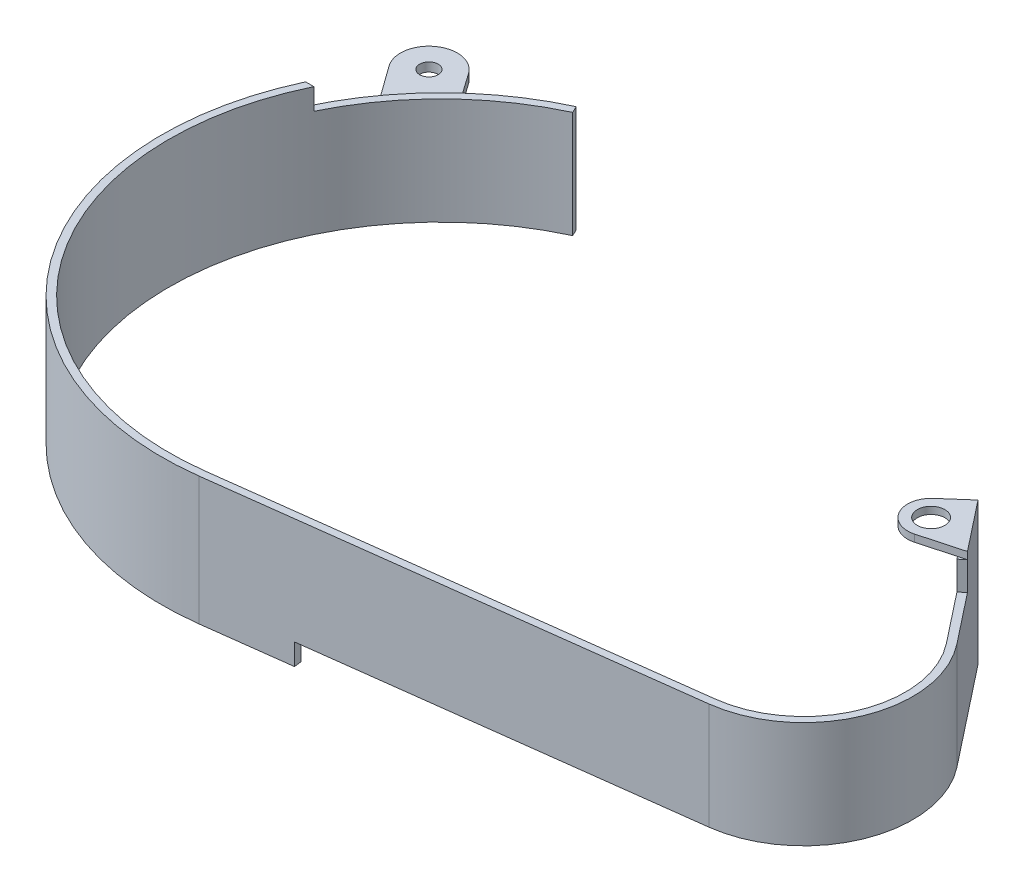
ISO-10303-21;
HEADER;
FILE_DESCRIPTION(('STEP AP214'),'2;1');
FILE_NAME('part.step','',(''),(''),'','','');
FILE_SCHEMA(('AUTOMOTIVE_DESIGN { 1 0 10303 214 1 1 1 1 }'));
ENDSEC;
DATA;
#1=APPLICATION_CONTEXT('core data for automotive mechanical design processes');
#2=APPLICATION_PROTOCOL_DEFINITION('international standard','automotive_design',2000,#1);
#3=PRODUCT_CONTEXT('',#1,'mechanical');
#4=PRODUCT('Part','Part','',(#3));
#5=PRODUCT_RELATED_PRODUCT_CATEGORY('part','',(#4));
#6=PRODUCT_DEFINITION_FORMATION('','',#4);
#7=PRODUCT_DEFINITION_CONTEXT('part definition',#1,'design');
#8=PRODUCT_DEFINITION('design','',#6,#7);
#9=PRODUCT_DEFINITION_SHAPE('','',#8);
#10=(LENGTH_UNIT() NAMED_UNIT(*) SI_UNIT(.MILLI.,.METRE.));
#11=(NAMED_UNIT(*) PLANE_ANGLE_UNIT() SI_UNIT($,.RADIAN.));
#12=(NAMED_UNIT(*) SI_UNIT($,.STERADIAN.) SOLID_ANGLE_UNIT());
#13=UNCERTAINTY_MEASURE_WITH_UNIT(LENGTH_MEASURE(1.E-05),#10,'distance_accuracy_value','');
#14=(GEOMETRIC_REPRESENTATION_CONTEXT(3) GLOBAL_UNCERTAINTY_ASSIGNED_CONTEXT((#13)) GLOBAL_UNIT_ASSIGNED_CONTEXT((#10,
#11,#12)) REPRESENTATION_CONTEXT('',''));
#15=CARTESIAN_POINT('',(0.,0.,0.));
#16=DIRECTION('',(0.,0.,1.));
#17=DIRECTION('',(1.,0.,0.));
#18=AXIS2_PLACEMENT_3D('',#15,#16,#17);
#19=CARTESIAN_POINT('',(0.,10.16,0.));
#20=DIRECTION('',(0.,-1.,0.));
#21=DIRECTION('',(0.,0.,-1.));
#22=AXIS2_PLACEMENT_3D('',#19,#20,#21);
#23=PLANE('',#22);
#24=DIRECTION('',(0.964468458141536,0.,-0.264198019012422));
#25=VECTOR('',#24,1.);
#26=CARTESIAN_POINT('',(-498.33467142778,10.16,85.9682052283559));
#27=LINE('',#26,#25);
#28=CARTESIAN_POINT('',(-486.340425898208,10.16,82.6826069470314));
#29=VERTEX_POINT('',#28);
#30=CARTESIAN_POINT('',(-483.547414247584,10.16,81.9175138649877));
#31=VERTEX_POINT('',#30);
#32=EDGE_CURVE('E12',#29,#31,#27,.T.);
#33=ORIENTED_EDGE('',*,*,#32,.F.);
#34=DIRECTION('',(0.619138375896092,0.,0.785281905746433));
#35=VECTOR('',#34,1.);
#36=CARTESIAN_POINT('',(-499.562056453275,10.16,65.9129999519377));
#37=LINE('',#36,#35);
#38=CARTESIAN_POINT('',(-485.591791320348,10.16,83.6321348892451));
#39=VERTEX_POINT('',#38);
#40=EDGE_CURVE('E252',#29,#39,#37,.T.);
#41=ORIENTED_EDGE('',*,*,#40,.T.);
#42=DIRECTION('',(0.766194829754674,0.,-0.642608343283221));
#43=VECTOR('',#42,1.);
#44=CARTESIAN_POINT('',(-485.591791320348,10.16,83.6321348892451));
#45=LINE('',#44,#43);
#46=EDGE_CURVE('E257',#39,#31,#45,.T.);
#47=ORIENTED_EDGE('',*,*,#46,.T.);
#48=EDGE_LOOP('',(#33,#41,#47));
#49=FACE_BOUND('',#48,.T.);
#50=ADVANCED_FACE('F50',(#49),#23,.F.);
#51=CARTESIAN_POINT('',(-669.29,0.,84.2514773719377));
#52=DIRECTION('',(0.,-1.,0.));
#53=DIRECTION('',(0.,0.,-1.));
#54=AXIS2_PLACEMENT_3D('',#51,#52,#53);
#55=PLANE('',#54);
#56=DIRECTION('',(0.766194829754674,0.,-0.642608343283221));
#57=VECTOR('',#56,1.);
#58=CARTESIAN_POINT('',(-485.591791320348,0.,83.6321348892451));
#59=LINE('',#58,#57);
#60=CARTESIAN_POINT('',(-485.591791320348,0.,83.6321348892451));
#61=VERTEX_POINT('',#60);
#62=CARTESIAN_POINT('',(-483.547414247584,0.,81.9175138649877));
#63=VERTEX_POINT('',#62);
#64=EDGE_CURVE('E75',#61,#63,#59,.T.);
#65=ORIENTED_EDGE('',*,*,#64,.F.);
#66=DIRECTION('',(0.61913837589609,0.,0.785281905746435));
#67=VECTOR('',#66,1.);
#68=CARTESIAN_POINT('',(-471.62152618742,0.,101.351269826553));
#69=LINE('',#68,#67);
#70=CARTESIAN_POINT('',(-471.62152618742,0.,101.351269826552));
#71=VERTEX_POINT('',#70);
#72=EDGE_CURVE('E421',#61,#71,#69,.T.);
#73=ORIENTED_EDGE('',*,*,#72,.T.);
#74=CARTESIAN_POINT('',(-500.126000000001,0.,123.824999951937));
#75=DIRECTION('',(0.,-1.,0.));
#76=DIRECTION('',(0.,0.,1.));
#77=AXIS2_PLACEMENT_3D('',#74,#75,#76);
#78=CIRCLE('',#77,36.2983962880004);
#79=CARTESIAN_POINT('',(-495.540915966686,0.,159.832646049512));
#80=VERTEX_POINT('',#79);
#81=EDGE_CURVE('E424',#71,#80,#78,.T.);
#82=ORIENTED_EDGE('',*,*,#81,.T.);
#83=DIRECTION('',(-0.991989999003838,0.,0.126316435495806));
#84=VECTOR('',#83,1.);
#85=CARTESIAN_POINT('',(-657.047015902535,0.,180.398251423772));
#86=LINE('',#85,#84);
#87=CARTESIAN_POINT('',(-657.047015902535,0.,180.398251423772));
#88=VERTEX_POINT('',#87);
#89=EDGE_CURVE('E380',#80,#88,#86,.T.);
#90=ORIENTED_EDGE('',*,*,#89,.T.);
#91=CARTESIAN_POINT('',(-669.29,0.,84.2514773719377));
#92=DIRECTION('',(0.,-1.,0.));
#93=DIRECTION('',(0.,0.,-1.));
#94=AXIS2_PLACEMENT_3D('',#91,#92,#93);
#95=CIRCLE('',#94,96.9231284069251);
#96=CARTESIAN_POINT('',(-756.600744677042,0.,42.1690976373534));
#97=VERTEX_POINT('',#96);
#98=EDGE_CURVE('E373',#88,#97,#95,.T.);
#99=ORIENTED_EDGE('',*,*,#98,.T.);
#100=DIRECTION('',(1.,0.,0.));
#101=VECTOR('',#100,1.);
#102=CARTESIAN_POINT('',(-756.600744677042,0.,42.1690976373534));
#103=LINE('',#102,#101);
#104=CARTESIAN_POINT('',(-759.552212425699,0.,42.1690976373534));
#105=VERTEX_POINT('',#104);
#106=EDGE_CURVE('E342',#105,#97,#103,.T.);
#107=ORIENTED_EDGE('',*,*,#106,.F.);
#108=CARTESIAN_POINT('',(-669.29,0.,84.2514773719377));
#109=DIRECTION('',(0.,1.,0.));
#110=DIRECTION('',(0.,0.,-1.));
#111=AXIS2_PLACEMENT_3D('',#108,#109,#110);
#112=CIRCLE('',#111,99.590128406925);
#113=CARTESIAN_POINT('',(-656.710129969068,0.,183.043888751115));
#114=VERTEX_POINT('',#113);
#115=EDGE_CURVE('E407',#105,#114,#112,.T.);
#116=ORIENTED_EDGE('',*,*,#115,.T.);
#117=DIRECTION('',(0.991989999003838,0.,-0.126316435495805));
#118=VECTOR('',#117,1.);
#119=CARTESIAN_POINT('',(-656.710129969068,0.,183.043888751115));
#120=LINE('',#119,#118);
#121=CARTESIAN_POINT('',(-495.204030033218,0.,162.478283376855));
#122=VERTEX_POINT('',#121);
#123=EDGE_CURVE('E410',#114,#122,#120,.T.);
#124=ORIENTED_EDGE('',*,*,#123,.T.);
#125=CARTESIAN_POINT('',(-500.126,0.,123.824999951938));
#126=DIRECTION('',(0.,1.,0.));
#127=DIRECTION('',(0.,0.,-1.));
#128=AXIS2_PLACEMENT_3D('',#125,#126,#127);
#129=CIRCLE('',#128,38.9653962880001);
#130=CARTESIAN_POINT('',(-469.527179344794,0.,99.7000277780376));
#131=VERTEX_POINT('',#130);
#132=EDGE_CURVE('E414',#122,#131,#129,.T.);
#133=ORIENTED_EDGE('',*,*,#132,.T.);
#134=DIRECTION('',(-0.619138375896093,0.,-0.785281905746432));
#135=VECTOR('',#134,1.);
#136=CARTESIAN_POINT('',(-469.527179344794,0.,99.7000277780376));
#137=LINE('',#136,#135);
#138=EDGE_CURVE('E418',#131,#63,#137,.T.);
#139=ORIENTED_EDGE('',*,*,#138,.T.);
#140=EDGE_LOOP('',(#65,#73,#82,#90,#99,#107,#116,#124,#133,#139));
#141=FACE_BOUND('',#140,.T.);
#142=ADVANCED_FACE('F485',(#141),#55,.F.);
#143=CARTESIAN_POINT('',(-669.29,-38.1,84.2514773719377));
#144=DIRECTION('',(0.,1.,0.));
#145=DIRECTION('',(0.,0.,1.));
#146=AXIS2_PLACEMENT_3D('',#143,#144,#145);
#147=CYLINDRICAL_SURFACE('',#146,99.590128406925);
#148=DIRECTION('',(0.,1.,0.));
#149=VECTOR('',#148,1.);
#150=CARTESIAN_POINT('',(-759.552212425699,-7.62,42.1690976373533));
#151=LINE('',#150,#149);
#152=CARTESIAN_POINT('',(-759.552212425699,-7.62,42.1690976373533));
#153=VERTEX_POINT('',#152);
#154=EDGE_CURVE('E366',#153,#105,#151,.T.);
#155=ORIENTED_EDGE('',*,*,#154,.F.);
#156=CARTESIAN_POINT('',(-669.29,-7.62,84.2514773719377));
#157=DIRECTION('',(0.,1.,0.));
#158=DIRECTION('',(0.,0.,-1.));
#159=AXIS2_PLACEMENT_3D('',#156,#157,#158);
#160=CIRCLE('',#159,99.5901284069251);
#161=CARTESIAN_POINT('',(-711.2,-7.62,-6.0909023626467));
#162=VERTEX_POINT('',#161);
#163=EDGE_CURVE('E359',#162,#153,#160,.T.);
#164=ORIENTED_EDGE('',*,*,#163,.F.);
#165=DIRECTION('',(0.,1.,0.));
#166=VECTOR('',#165,1.);
#167=CARTESIAN_POINT('',(-711.2,-38.1,-6.0909023626466));
#168=LINE('',#167,#166);
#169=CARTESIAN_POINT('',(-711.2,-45.72,-6.0909023626466));
#170=VERTEX_POINT('',#169);
#171=EDGE_CURVE('E455',#170,#162,#168,.T.);
#172=ORIENTED_EDGE('',*,*,#171,.F.);
#173=CARTESIAN_POINT('',(-669.29,-45.72,84.2514773719377));
#174=DIRECTION('',(0.,-1.,0.));
#175=DIRECTION('',(0.,0.,-1.));
#176=AXIS2_PLACEMENT_3D('',#173,#174,#175);
#177=CIRCLE('',#176,99.590128406925);
#178=CARTESIAN_POINT('',(-656.710129969068,-45.72,183.043888751115));
#179=VERTEX_POINT('',#178);
#180=EDGE_CURVE('E282',#179,#170,#177,.T.);
#181=ORIENTED_EDGE('',*,*,#180,.F.);
#182=DIRECTION('',(0.,1.,0.));
#183=VECTOR('',#182,1.);
#184=CARTESIAN_POINT('',(-656.710129969068,-38.1,183.043888751115));
#185=LINE('',#184,#183);
#186=EDGE_CURVE('E452',#179,#114,#185,.T.);
#187=ORIENTED_EDGE('',*,*,#186,.T.);
#188=ORIENTED_EDGE('',*,*,#115,.F.);
#189=EDGE_LOOP('',(#155,#164,#172,#181,#187,#188));
#190=FACE_BOUND('',#189,.T.);
#191=DIRECTION('',(0.,1.,0.));
#192=VECTOR('',#191,1.);
#193=CARTESIAN_POINT('',(-750.190181644092,-15.10675668,26.1708929563116));
#194=LINE('',#193,#192);
#195=CARTESIAN_POINT('',(-750.190181644093,-15.10675668,26.1708929563117));
#196=VERTEX_POINT('',#195);
#197=CARTESIAN_POINT('',(-750.190181644093,-11.93175668,26.1708929563116));
#198=VERTEX_POINT('',#197);
#199=EDGE_CURVE('E322',#196,#198,#194,.T.);
#200=ORIENTED_EDGE('',*,*,#199,.F.);
#201=CARTESIAN_POINT('',(-669.29,-15.10675668,84.2514773719377));
#202=DIRECTION('',(0.,1.,0.));
#203=DIRECTION('',(0.,0.,1.));
#204=AXIS2_PLACEMENT_3D('',#201,#202,#203);
#205=CIRCLE('',#204,99.590128406925);
#206=CARTESIAN_POINT('',(-736.454096433677,-15.10675668,10.717962384855));
#207=VERTEX_POINT('',#206);
#208=EDGE_CURVE('E306',#207,#196,#205,.T.);
#209=ORIENTED_EDGE('',*,*,#208,.F.);
#210=DIRECTION('',(0.,1.,0.));
#211=VECTOR('',#210,1.);
#212=CARTESIAN_POINT('',(-736.454096433677,-15.10675668,10.7179623848548));
#213=LINE('',#212,#211);
#214=CARTESIAN_POINT('',(-736.454096433677,-11.93175668,10.7179623848548));
#215=VERTEX_POINT('',#214);
#216=EDGE_CURVE('E347',#207,#215,#213,.T.);
#217=ORIENTED_EDGE('',*,*,#216,.T.);
#218=CARTESIAN_POINT('',(-669.29,-11.93175668,84.2514773719377));
#219=DIRECTION('',(0.,1.,0.));
#220=DIRECTION('',(0.,0.,1.));
#221=AXIS2_PLACEMENT_3D('',#218,#219,#220);
#222=CIRCLE('',#221,99.590128406925);
#223=EDGE_CURVE('E326',#215,#198,#222,.T.);
#224=ORIENTED_EDGE('',*,*,#223,.T.);
#225=EDGE_LOOP('',(#200,#209,#217,#224));
#226=FACE_BOUND('',#225,.T.);
#227=ADVANCED_FACE('F473',(#190,#226),#147,.T.);
#228=CARTESIAN_POINT('',(-710.077660147768,-38.1,-3.6715548770441));
#229=DIRECTION('',(0.907141914361682,0.,-0.420824841481849));
#230=DIRECTION('',(-0.420824841481849,0.,-0.907141914361682));
#231=AXIS2_PLACEMENT_3D('',#228,#229,#230);
#232=PLANE('',#231);
#233=ORIENTED_EDGE('',*,*,#171,.T.);
#234=DIRECTION('',(-0.420824841481849,0.,-0.907141914361682));
#235=VECTOR('',#234,1.);
#236=CARTESIAN_POINT('',(-710.077660147768,-7.62,-3.6715548770441));
#237=LINE('',#236,#235);
#238=CARTESIAN_POINT('',(-710.077660147768,-7.62,-3.6715548770441));
#239=VERTEX_POINT('',#238);
#240=EDGE_CURVE('E356',#239,#162,#237,.T.);
#241=ORIENTED_EDGE('',*,*,#240,.F.);
#242=DIRECTION('',(0.,1.,0.));
#243=VECTOR('',#242,1.);
#244=CARTESIAN_POINT('',(-710.077660147768,-38.1,-3.6715548770441));
#245=LINE('',#244,#243);
#246=CARTESIAN_POINT('',(-710.077660147768,-45.72,-3.6715548770441));
#247=VERTEX_POINT('',#246);
#248=EDGE_CURVE('E54',#247,#239,#245,.T.);
#249=ORIENTED_EDGE('',*,*,#248,.F.);
#250=DIRECTION('',(0.420824841481863,0.,0.907141914361675));
#251=VECTOR('',#250,1.);
#252=CARTESIAN_POINT('',(-710.077660147768,-45.72,-3.6715548770441));
#253=LINE('',#252,#251);
#254=EDGE_CURVE('E286',#170,#247,#253,.T.);
#255=ORIENTED_EDGE('',*,*,#254,.F.);
#256=EDGE_LOOP('',(#233,#241,#249,#255));
#257=FACE_BOUND('',#256,.T.);
#258=ADVANCED_FACE('F466',(#257),#232,.T.);
#259=CARTESIAN_POINT('',(-669.29,-38.1,84.2514773719377));
#260=DIRECTION('',(0.,1.,0.));
#261=DIRECTION('',(0.,0.,1.));
#262=AXIS2_PLACEMENT_3D('',#259,#260,#261);
#263=CYLINDRICAL_SURFACE('',#262,96.9231284069251);
#264=DIRECTION('',(0.,1.,0.));
#265=VECTOR('',#264,1.);
#266=CARTESIAN_POINT('',(-756.600744677042,-7.62,42.1690976373534));
#267=LINE('',#266,#265);
#268=CARTESIAN_POINT('',(-756.600744677042,-7.62,42.1690976373534));
#269=VERTEX_POINT('',#268);
#270=EDGE_CURVE('E369',#269,#97,#267,.T.);
#271=ORIENTED_EDGE('',*,*,#270,.T.);
#272=ORIENTED_EDGE('',*,*,#98,.F.);
#273=DIRECTION('',(0.,1.,0.));
#274=VECTOR('',#273,1.);
#275=CARTESIAN_POINT('',(-657.047015902535,-38.1,180.398251423772));
#276=LINE('',#275,#274);
#277=CARTESIAN_POINT('',(-657.047015902535,-45.72,180.398251423772));
#278=VERTEX_POINT('',#277);
#279=EDGE_CURVE('E60',#278,#88,#276,.T.);
#280=ORIENTED_EDGE('',*,*,#279,.F.);
#281=CARTESIAN_POINT('',(-669.29,-45.72,84.2514773719377));
#282=DIRECTION('',(0.,1.,0.));
#283=DIRECTION('',(0.,0.,-1.));
#284=AXIS2_PLACEMENT_3D('',#281,#282,#283);
#285=CIRCLE('',#284,96.9231284069251);
#286=EDGE_CURVE('E268',#247,#278,#285,.T.);
#287=ORIENTED_EDGE('',*,*,#286,.F.);
#288=ORIENTED_EDGE('',*,*,#248,.T.);
#289=CARTESIAN_POINT('',(-669.29,-7.62,84.2514773719377));
#290=DIRECTION('',(0.,-1.,0.));
#291=DIRECTION('',(0.,0.,1.));
#292=AXIS2_PLACEMENT_3D('',#289,#290,#291);
#293=CIRCLE('',#292,96.9231284069251);
#294=EDGE_CURVE('E353',#269,#239,#293,.T.);
#295=ORIENTED_EDGE('',*,*,#294,.F.);
#296=EDGE_LOOP('',(#271,#272,#280,#287,#288,#295));
#297=FACE_BOUND('',#296,.T.);
#298=ADVANCED_FACE('F52',(#297),#263,.F.);
#299=CARTESIAN_POINT('',(-657.047015902535,-38.1,180.398251423772));
#300=DIRECTION('',(-0.126316435495806,0.,-0.991989999003838));
#301=DIRECTION('',(-0.991989999003838,0.,0.126316435495806));
#302=AXIS2_PLACEMENT_3D('',#299,#300,#301);
#303=PLANE('',#302);
#304=ORIENTED_EDGE('',*,*,#89,.F.);
#305=DIRECTION('',(0.,1.,0.));
#306=VECTOR('',#305,1.);
#307=CARTESIAN_POINT('',(-495.540915966686,-38.1,159.832646049512));
#308=LINE('',#307,#306);
#309=CARTESIAN_POINT('',(-495.540915966686,-38.1,159.832646049512));
#310=VERTEX_POINT('',#309);
#311=EDGE_CURVE('E433',#310,#80,#308,.T.);
#312=ORIENTED_EDGE('',*,*,#311,.F.);
#313=DIRECTION('',(-0.991989999003838,0.,0.126316435495806));
#314=VECTOR('',#313,1.);
#315=CARTESIAN_POINT('',(-657.047015902535,-38.1,180.398251423772));
#316=LINE('',#315,#314);
#317=CARTESIAN_POINT('',(-626.811160732898,-38.1,176.54812646986));
#318=VERTEX_POINT('',#317);
#319=EDGE_CURVE('E400',#310,#318,#316,.T.);
#320=ORIENTED_EDGE('',*,*,#319,.T.);
#321=DIRECTION('',(0.,1.,0.));
#322=VECTOR('',#321,1.);
#323=CARTESIAN_POINT('',(-626.811160732898,-45.72,176.54812646986));
#324=LINE('',#323,#322);
#325=CARTESIAN_POINT('',(-626.811160732898,-45.72,176.54812646986));
#326=VERTEX_POINT('',#325);
#327=EDGE_CURVE('E297',#326,#318,#324,.T.);
#328=ORIENTED_EDGE('',*,*,#327,.F.);
#329=DIRECTION('',(0.991989999003838,0.,-0.126316435495804));
#330=VECTOR('',#329,1.);
#331=CARTESIAN_POINT('',(-657.047015902535,-45.72,180.398251423772));
#332=LINE('',#331,#330);
#333=EDGE_CURVE('E272',#278,#326,#332,.T.);
#334=ORIENTED_EDGE('',*,*,#333,.F.);
#335=ORIENTED_EDGE('',*,*,#279,.T.);
#336=EDGE_LOOP('',(#304,#312,#320,#328,#334,#335));
#337=FACE_BOUND('',#336,.T.);
#338=ADVANCED_FACE('F489',(#337),#303,.T.);
#339=CARTESIAN_POINT('',(-500.126000000001,-38.1,123.824999951937));
#340=DIRECTION('',(0.,1.,0.));
#341=DIRECTION('',(0.,0.,1.));
#342=AXIS2_PLACEMENT_3D('',#339,#340,#341);
#343=CYLINDRICAL_SURFACE('',#342,36.2983962880004);
#344=ORIENTED_EDGE('',*,*,#81,.F.);
#345=DIRECTION('',(0.,1.,0.));
#346=VECTOR('',#345,1.);
#347=CARTESIAN_POINT('',(-471.62152618742,-38.1,101.351269826552));
#348=LINE('',#347,#346);
#349=CARTESIAN_POINT('',(-471.62152618742,-38.1,101.351269826552));
#350=VERTEX_POINT('',#349);
#351=EDGE_CURVE('E436',#350,#71,#348,.T.);
#352=ORIENTED_EDGE('',*,*,#351,.F.);
#353=CARTESIAN_POINT('',(-500.126000000001,-38.1,123.824999951937));
#354=DIRECTION('',(0.,-1.,0.));
#355=DIRECTION('',(0.,0.,1.));
#356=AXIS2_PLACEMENT_3D('',#353,#354,#355);
#357=CIRCLE('',#356,36.2983962880004);
#358=EDGE_CURVE('E396',#350,#310,#357,.T.);
#359=ORIENTED_EDGE('',*,*,#358,.T.);
#360=ORIENTED_EDGE('',*,*,#311,.T.);
#361=EDGE_LOOP('',(#344,#352,#359,#360));
#362=FACE_BOUND('',#361,.T.);
#363=ADVANCED_FACE('F515',(#362),#343,.F.);
#364=CARTESIAN_POINT('',(-471.62152618742,-38.1,101.351269826553));
#365=DIRECTION('',(-0.785281905746434,0.,0.61913837589609));
#366=DIRECTION('',(0.61913837589609,0.,0.785281905746435));
#367=AXIS2_PLACEMENT_3D('',#364,#365,#366);
#368=PLANE('',#367);
#369=ORIENTED_EDGE('',*,*,#72,.F.);
#370=DIRECTION('',(0.,-1.,0.));
#371=VECTOR('',#370,1.);
#372=CARTESIAN_POINT('',(-485.591791320348,10.16,83.6321348892451));
#373=LINE('',#372,#371);
#374=EDGE_CURVE('E263',#39,#61,#373,.T.);
#375=ORIENTED_EDGE('',*,*,#374,.F.);
#376=ORIENTED_EDGE('',*,*,#40,.F.);
#377=CARTESIAN_POINT('',(-499.562056453275,10.16,65.9129999519377));
#378=VERTEX_POINT('',#377);
#379=EDGE_CURVE('E253',#378,#29,#37,.T.);
#380=ORIENTED_EDGE('',*,*,#379,.F.);
#381=DIRECTION('',(0.,1.,0.));
#382=VECTOR('',#381,1.);
#383=CARTESIAN_POINT('',(-499.562056453275,-38.1,65.9129999519377));
#384=LINE('',#383,#382);
#385=CARTESIAN_POINT('',(-499.562056453275,-38.1,65.9129999519377));
#386=VERTEX_POINT('',#385);
#387=EDGE_CURVE('E440',#386,#378,#384,.T.);
#388=ORIENTED_EDGE('',*,*,#387,.F.);
#389=DIRECTION('',(0.61913837589609,0.,0.785281905746435));
#390=VECTOR('',#389,1.);
#391=CARTESIAN_POINT('',(-471.62152618742,-38.1,101.351269826553));
#392=LINE('',#391,#390);
#393=EDGE_CURVE('E392',#386,#350,#392,.T.);
#394=ORIENTED_EDGE('',*,*,#393,.T.);
#395=ORIENTED_EDGE('',*,*,#351,.T.);
#396=EDGE_LOOP('',(#369,#375,#376,#380,#388,#394,#395));
#397=FACE_BOUND('',#396,.T.);
#398=ADVANCED_FACE('F511',(#397),#368,.T.);
#399=CARTESIAN_POINT('',(-499.562056453275,-38.1,65.9129999519377));
#400=DIRECTION('',(-0.665448965296002,0.,-0.74644334988429));
#401=DIRECTION('',(-0.74644334988429,0.,0.665448965296002));
#402=AXIS2_PLACEMENT_3D('',#399,#400,#401);
#403=PLANE('',#402);
#404=ORIENTED_EDGE('',*,*,#387,.T.);
#405=DIRECTION('',(-0.74644334988429,0.,0.665448965296002));
#406=VECTOR('',#405,1.);
#407=CARTESIAN_POINT('',(-497.567649150374,10.16,64.1349999519377));
#408=LINE('',#407,#406);
#409=CARTESIAN_POINT('',(-497.567649150374,10.16,64.1349999519377));
#410=VERTEX_POINT('',#409);
#411=EDGE_CURVE('E243',#410,#378,#408,.T.);
#412=ORIENTED_EDGE('',*,*,#411,.F.);
#413=DIRECTION('',(0.,1.,0.));
#414=VECTOR('',#413,1.);
#415=CARTESIAN_POINT('',(-497.567649150374,-38.1,64.1349999519377));
#416=LINE('',#415,#414);
#417=CARTESIAN_POINT('',(-497.567649150374,-38.1,64.1349999519377));
#418=VERTEX_POINT('',#417);
#419=EDGE_CURVE('E443',#418,#410,#416,.T.);
#420=ORIENTED_EDGE('',*,*,#419,.F.);
#421=DIRECTION('',(-0.74644334988429,0.,0.665448965296002));
#422=VECTOR('',#421,1.);
#423=CARTESIAN_POINT('',(-499.562056453275,-38.1,65.9129999519377));
#424=LINE('',#423,#422);
#425=EDGE_CURVE('E388',#418,#386,#424,.T.);
#426=ORIENTED_EDGE('',*,*,#425,.T.);
#427=EDGE_LOOP('',(#404,#412,#420,#426));
#428=FACE_BOUND('',#427,.T.);
#429=ADVANCED_FACE('F522',(#428),#403,.T.);
#430=CARTESIAN_POINT('',(-469.527179344794,-38.1,99.7000277780376));
#431=DIRECTION('',(0.785281905746432,0.,-0.619138375896092));
#432=DIRECTION('',(-0.619138375896093,0.,-0.785281905746433));
#433=AXIS2_PLACEMENT_3D('',#430,#431,#432);
#434=PLANE('',#433);
#435=ORIENTED_EDGE('',*,*,#138,.F.);
#436=DIRECTION('',(0.,1.,0.));
#437=VECTOR('',#436,1.);
#438=CARTESIAN_POINT('',(-469.527179344794,-38.1,99.7000277780376));
#439=LINE('',#438,#437);
#440=CARTESIAN_POINT('',(-469.527179344794,-38.1,99.7000277780376));
#441=VERTEX_POINT('',#440);
#442=EDGE_CURVE('E446',#441,#131,#439,.T.);
#443=ORIENTED_EDGE('',*,*,#442,.F.);
#444=DIRECTION('',(-0.619138375896093,0.,-0.785281905746432));
#445=VECTOR('',#444,1.);
#446=CARTESIAN_POINT('',(-469.527179344794,-38.1,99.7000277780376));
#447=LINE('',#446,#445);
#448=EDGE_CURVE('E384',#441,#418,#447,.T.);
#449=ORIENTED_EDGE('',*,*,#448,.T.);
#450=ORIENTED_EDGE('',*,*,#419,.T.);
#451=DIRECTION('',(0.,-1.,0.));
#452=VECTOR('',#451,1.);
#453=CARTESIAN_POINT('',(-497.567649150374,12.7,64.1349999519377));
#454=LINE('',#453,#452);
#455=CARTESIAN_POINT('',(-497.567649150374,12.7,64.1349999519377));
#456=VERTEX_POINT('',#455);
#457=EDGE_CURVE('E219',#456,#410,#454,.T.);
#458=ORIENTED_EDGE('',*,*,#457,.F.);
#459=DIRECTION('',(-0.619138375896093,0.,-0.785281905746432));
#460=VECTOR('',#459,1.);
#461=CARTESIAN_POINT('',(-483.547414247584,12.7,81.9175138649877));
#462=LINE('',#461,#460);
#463=CARTESIAN_POINT('',(-483.547414247584,12.7,81.9175138649877));
#464=VERTEX_POINT('',#463);
#465=EDGE_CURVE('E211',#464,#456,#462,.T.);
#466=ORIENTED_EDGE('',*,*,#465,.F.);
#467=DIRECTION('',(0.,-1.,0.));
#468=VECTOR('',#467,1.);
#469=CARTESIAN_POINT('',(-483.547414247584,12.7,81.9175138649877));
#470=LINE('',#469,#468);
#471=EDGE_CURVE('E217',#464,#31,#470,.T.);
#472=ORIENTED_EDGE('',*,*,#471,.T.);
#473=DIRECTION('',(0.,-1.,0.));
#474=VECTOR('',#473,1.);
#475=CARTESIAN_POINT('',(-483.547414247584,10.16,81.9175138649877));
#476=LINE('',#475,#474);
#477=EDGE_CURVE('E259',#31,#63,#476,.T.);
#478=ORIENTED_EDGE('',*,*,#477,.T.);
#479=EDGE_LOOP('',(#435,#443,#449,#450,#458,#466,#472,#478));
#480=FACE_BOUND('',#479,.T.);
#481=ADVANCED_FACE('F214',(#480),#434,.T.);
#482=CARTESIAN_POINT('',(-500.126,-38.1,123.824999951938));
#483=DIRECTION('',(0.,1.,0.));
#484=DIRECTION('',(0.,0.,1.));
#485=AXIS2_PLACEMENT_3D('',#482,#483,#484);
#486=CYLINDRICAL_SURFACE('',#485,38.9653962880001);
#487=ORIENTED_EDGE('',*,*,#132,.F.);
#488=DIRECTION('',(0.,1.,0.));
#489=VECTOR('',#488,1.);
#490=CARTESIAN_POINT('',(-495.204030033218,-38.1,162.478283376855));
#491=LINE('',#490,#489);
#492=CARTESIAN_POINT('',(-495.204030033218,-38.1,162.478283376855));
#493=VERTEX_POINT('',#492);
#494=EDGE_CURVE('E449',#493,#122,#491,.T.);
#495=ORIENTED_EDGE('',*,*,#494,.F.);
#496=CARTESIAN_POINT('',(-500.126,-38.1,123.824999951938));
#497=DIRECTION('',(0.,1.,0.));
#498=DIRECTION('',(0.,0.,-1.));
#499=AXIS2_PLACEMENT_3D('',#496,#497,#498);
#500=CIRCLE('',#499,38.9653962880001);
#501=EDGE_CURVE('E379',#493,#441,#500,.T.);
#502=ORIENTED_EDGE('',*,*,#501,.T.);
#503=ORIENTED_EDGE('',*,*,#442,.T.);
#504=EDGE_LOOP('',(#487,#495,#502,#503));
#505=FACE_BOUND('',#504,.T.);
#506=ADVANCED_FACE('F501',(#505),#486,.T.);
#507=CARTESIAN_POINT('',(-656.710129969068,-38.1,183.043888751115));
#508=DIRECTION('',(0.126316435495805,0.,0.991989999003838));
#509=DIRECTION('',(0.991989999003838,0.,-0.126316435495805));
#510=AXIS2_PLACEMENT_3D('',#507,#508,#509);
#511=PLANE('',#510);
#512=ORIENTED_EDGE('',*,*,#123,.F.);
#513=ORIENTED_EDGE('',*,*,#186,.F.);
#514=DIRECTION('',(-0.991989999003838,0.,0.126316435495805));
#515=VECTOR('',#514,1.);
#516=CARTESIAN_POINT('',(-656.710129969068,-45.72,183.043888751115));
#517=LINE('',#516,#515);
#518=CARTESIAN_POINT('',(-626.474274799431,-45.72,179.193763797203));
#519=VERTEX_POINT('',#518);
#520=EDGE_CURVE('E278',#519,#179,#517,.T.);
#521=ORIENTED_EDGE('',*,*,#520,.F.);
#522=DIRECTION('',(0.,1.,0.));
#523=VECTOR('',#522,1.);
#524=CARTESIAN_POINT('',(-626.474274799431,-45.72,179.193763797203));
#525=LINE('',#524,#523);
#526=CARTESIAN_POINT('',(-626.474274799431,-38.1,179.193763797203));
#527=VERTEX_POINT('',#526);
#528=EDGE_CURVE('E290',#519,#527,#525,.T.);
#529=ORIENTED_EDGE('',*,*,#528,.T.);
#530=DIRECTION('',(0.991989999003838,0.,-0.126316435495805));
#531=VECTOR('',#530,1.);
#532=CARTESIAN_POINT('',(-656.710129969068,-38.1,183.043888751115));
#533=LINE('',#532,#531);
#534=EDGE_CURVE('E376',#527,#493,#533,.T.);
#535=ORIENTED_EDGE('',*,*,#534,.T.);
#536=ORIENTED_EDGE('',*,*,#494,.T.);
#537=EDGE_LOOP('',(#512,#513,#521,#529,#535,#536));
#538=FACE_BOUND('',#537,.T.);
#539=ADVANCED_FACE('F497',(#538),#511,.T.);
#540=CARTESIAN_POINT('',(-669.29,-38.1,84.2514773719377));
#541=DIRECTION('',(0.,-1.,0.));
#542=DIRECTION('',(0.,0.,-1.));
#543=AXIS2_PLACEMENT_3D('',#540,#541,#542);
#544=PLANE('',#543);
#545=DIRECTION('',(0.126316435495834,0.,0.991989999003834));
#546=VECTOR('',#545,1.);
#547=CARTESIAN_POINT('',(-626.474274799431,-38.1,179.193763797203));
#548=LINE('',#547,#546);
#549=EDGE_CURVE('E267',#318,#527,#548,.T.);
#550=ORIENTED_EDGE('',*,*,#549,.F.);
#551=ORIENTED_EDGE('',*,*,#319,.F.);
#552=ORIENTED_EDGE('',*,*,#358,.F.);
#553=ORIENTED_EDGE('',*,*,#393,.F.);
#554=ORIENTED_EDGE('',*,*,#425,.F.);
#555=ORIENTED_EDGE('',*,*,#448,.F.);
#556=ORIENTED_EDGE('',*,*,#501,.F.);
#557=ORIENTED_EDGE('',*,*,#534,.F.);
#558=EDGE_LOOP('',(#550,#551,#552,#553,#554,#555,#556,#557));
#559=FACE_BOUND('',#558,.T.);
#560=ADVANCED_FACE('F518',(#559),#544,.T.);
#561=CARTESIAN_POINT('',(-756.600744677042,-7.62,42.1690976373534));
#562=DIRECTION('',(0.,0.,1.));
#563=DIRECTION('',(1.,0.,0.));
#564=AXIS2_PLACEMENT_3D('',#561,#562,#563);
#565=PLANE('',#564);
#566=ORIENTED_EDGE('',*,*,#106,.T.);
#567=ORIENTED_EDGE('',*,*,#270,.F.);
#568=DIRECTION('',(1.,0.,0.));
#569=VECTOR('',#568,1.);
#570=CARTESIAN_POINT('',(-756.600744677042,-7.62,42.1690976373534));
#571=LINE('',#570,#569);
#572=EDGE_CURVE('E362',#153,#269,#571,.T.);
#573=ORIENTED_EDGE('',*,*,#572,.F.);
#574=ORIENTED_EDGE('',*,*,#154,.T.);
#575=EDGE_LOOP('',(#566,#567,#573,#574));
#576=FACE_BOUND('',#575,.T.);
#577=ADVANCED_FACE('F482',(#576),#565,.F.);
#578=CARTESIAN_POINT('',(-669.29,-7.62,84.2514773719377));
#579=DIRECTION('',(0.,1.,0.));
#580=DIRECTION('',(0.,0.,1.));
#581=AXIS2_PLACEMENT_3D('',#578,#579,#580);
#582=PLANE('',#581);
#583=ORIENTED_EDGE('',*,*,#294,.T.);
#584=ORIENTED_EDGE('',*,*,#240,.T.);
#585=ORIENTED_EDGE('',*,*,#163,.T.);
#586=ORIENTED_EDGE('',*,*,#572,.T.);
#587=EDGE_LOOP('',(#583,#584,#585,#586));
#588=FACE_BOUND('',#587,.T.);
#589=ADVANCED_FACE('F480',(#588),#582,.T.);
#590=CARTESIAN_POINT('',(-507.70910971181,-15.10675668,364.199499261916));
#591=DIRECTION('',(-0.812558414498444,0.,0.582879767214282));
#592=DIRECTION('',(0.582879767214282,0.,0.812558414498444));
#593=AXIS2_PLACEMENT_3D('',#590,#591,#592);
#594=PLANE('',#593);
#595=DIRECTION('',(0.582879767214282,0.,0.812558414498444));
#596=VECTOR('',#595,1.);
#597=CARTESIAN_POINT('',(-507.70910971181,-11.93175668,364.199499261916));
#598=LINE('',#597,#596);
#599=CARTESIAN_POINT('',(-761.574552778043,-11.93175668,10.3006104744292));
#600=VERTEX_POINT('',#599);
#601=EDGE_CURVE('E301',#600,#198,#598,.T.);
#602=ORIENTED_EDGE('',*,*,#601,.F.);
#603=DIRECTION('',(0.,1.,0.));
#604=VECTOR('',#603,1.);
#605=CARTESIAN_POINT('',(-761.574552778043,-15.10675668,10.3006104744292));
#606=LINE('',#605,#604);
#607=CARTESIAN_POINT('',(-761.574552778043,-15.10675668,10.3006104744292));
#608=VERTEX_POINT('',#607);
#609=EDGE_CURVE('E339',#608,#600,#606,.T.);
#610=ORIENTED_EDGE('',*,*,#609,.F.);
#611=DIRECTION('',(0.582879767214282,0.,0.812558414498444));
#612=VECTOR('',#611,1.);
#613=CARTESIAN_POINT('',(-507.70910971181,-15.10675668,364.199499261916));
#614=LINE('',#613,#612);
#615=EDGE_CURVE('E302',#608,#196,#614,.T.);
#616=ORIENTED_EDGE('',*,*,#615,.T.);
#617=ORIENTED_EDGE('',*,*,#199,.T.);
#618=EDGE_LOOP('',(#602,#610,#616,#617));
#619=FACE_BOUND('',#618,.T.);
#620=ADVANCED_FACE('F601',(#619),#594,.T.);
#621=CARTESIAN_POINT('',(-753.318959286739,-15.10675668,4.37855203953198));
#622=DIRECTION('',(0.,1.,0.));
#623=DIRECTION('',(0.,0.,1.));
#624=AXIS2_PLACEMENT_3D('',#621,#622,#623);
#625=CYLINDRICAL_SURFACE('',#624,10.16);
#626=CARTESIAN_POINT('',(-753.318959286739,-11.93175668,4.37855203953198));
#627=DIRECTION('',(0.,1.,0.));
#628=DIRECTION('',(0.,0.,1.));
#629=AXIS2_PLACEMENT_3D('',#626,#627,#628);
#630=CIRCLE('',#629,10.16);
#631=CARTESIAN_POINT('',(-745.003728119672,-11.93175668,-1.45947250976891));
#632=VERTEX_POINT('',#631);
#633=EDGE_CURVE('E333',#600,#632,#630,.F.);
#634=ORIENTED_EDGE('',*,*,#633,.T.);
#635=DIRECTION('',(0.,1.,0.));
#636=VECTOR('',#635,1.);
#637=CARTESIAN_POINT('',(-745.003728119672,-15.10675668,-1.45947250976891));
#638=LINE('',#637,#636);
#639=CARTESIAN_POINT('',(-745.003728119672,-15.10675668,-1.45947250976891));
#640=VERTEX_POINT('',#639);
#641=EDGE_CURVE('E343',#640,#632,#638,.T.);
#642=ORIENTED_EDGE('',*,*,#641,.F.);
#643=CARTESIAN_POINT('',(-753.318959286739,-15.10675668,4.37855203953198));
#644=DIRECTION('',(0.,1.,0.));
#645=DIRECTION('',(0.,0.,1.));
#646=AXIS2_PLACEMENT_3D('',#643,#644,#645);
#647=CIRCLE('',#646,10.16);
#648=EDGE_CURVE('E315',#608,#640,#647,.F.);
#649=ORIENTED_EDGE('',*,*,#648,.F.);
#650=ORIENTED_EDGE('',*,*,#609,.T.);
#651=EDGE_LOOP('',(#634,#642,#649,#650));
#652=FACE_BOUND('',#651,.T.);
#653=ADVANCED_FACE('F598',(#652),#625,.T.);
#654=CARTESIAN_POINT('',(-498.335636221341,-15.10675668,349.875501907155));
#655=DIRECTION('',(-0.818428264475097,0.,0.574608715482354));
#656=DIRECTION('',(0.574608715482354,0.,0.818428264475097));
#657=AXIS2_PLACEMENT_3D('',#654,#655,#656);
#658=PLANE('',#657);
#659=DIRECTION('',(0.574608715482354,0.,0.818428264475097));
#660=VECTOR('',#659,1.);
#661=CARTESIAN_POINT('',(-498.335636221341,-11.93175668,349.875501907155));
#662=LINE('',#661,#660);
#663=EDGE_CURVE('E329',#632,#215,#662,.T.);
#664=ORIENTED_EDGE('',*,*,#663,.T.);
#665=ORIENTED_EDGE('',*,*,#216,.F.);
#666=DIRECTION('',(0.574608715482354,0.,0.818428264475097));
#667=VECTOR('',#666,1.);
#668=CARTESIAN_POINT('',(-498.335636221341,-15.10675668,349.875501907155));
#669=LINE('',#668,#667);
#670=EDGE_CURVE('E311',#640,#207,#669,.T.);
#671=ORIENTED_EDGE('',*,*,#670,.F.);
#672=ORIENTED_EDGE('',*,*,#641,.T.);
#673=EDGE_LOOP('',(#664,#665,#671,#672));
#674=FACE_BOUND('',#673,.T.);
#675=ADVANCED_FACE('F596',(#674),#658,.F.);
#676=CARTESIAN_POINT('',(-753.318959286739,-15.10675668,4.37855203953198));
#677=DIRECTION('',(0.,1.,0.));
#678=DIRECTION('',(0.,0.,1.));
#679=AXIS2_PLACEMENT_3D('',#676,#677,#678);
#680=CYLINDRICAL_SURFACE('',#679,3.30000000029942);
#681=CARTESIAN_POINT('',(-753.318959286739,-15.10675668,4.37855203953198));
#682=DIRECTION('',(0.,1.,0.));
#683=DIRECTION('',(0.,0.,1.));
#684=AXIS2_PLACEMENT_3D('',#681,#682,#683);
#685=CIRCLE('',#684,3.30000000029942);
#686=CARTESIAN_POINT('',(-753.318959286739,-15.10675668,7.6785520398314));
#687=VERTEX_POINT('',#686);
#688=EDGE_CURVE('E318',#687,#687,#685,.T.);
#689=ORIENTED_EDGE('',*,*,#688,.F.);
#690=EDGE_LOOP('',(#689));
#691=FACE_BOUND('',#690,.T.);
#692=CARTESIAN_POINT('',(-753.318959286739,-11.93175668,4.37855203953198));
#693=DIRECTION('',(0.,1.,0.));
#694=DIRECTION('',(0.,0.,1.));
#695=AXIS2_PLACEMENT_3D('',#692,#693,#694);
#696=CIRCLE('',#695,3.30000000029942);
#697=CARTESIAN_POINT('',(-753.318959286739,-11.93175668,7.6785520398314));
#698=VERTEX_POINT('',#697);
#699=EDGE_CURVE('E307',#698,#698,#696,.T.);
#700=ORIENTED_EDGE('',*,*,#699,.T.);
#701=EDGE_LOOP('',(#700));
#702=FACE_BOUND('',#701,.T.);
#703=ADVANCED_FACE('F589',(#691,#702),#680,.F.);
#704=CARTESIAN_POINT('',(0.,-15.10675668,0.));
#705=DIRECTION('',(0.,1.,0.));
#706=DIRECTION('',(0.,0.,1.));
#707=AXIS2_PLACEMENT_3D('',#704,#705,#706);
#708=PLANE('',#707);
#709=ORIENTED_EDGE('',*,*,#615,.F.);
#710=ORIENTED_EDGE('',*,*,#648,.T.);
#711=ORIENTED_EDGE('',*,*,#670,.T.);
#712=ORIENTED_EDGE('',*,*,#208,.T.);
#713=EDGE_LOOP('',(#709,#710,#711,#712));
#714=FACE_BOUND('',#713,.T.);
#715=ORIENTED_EDGE('',*,*,#688,.T.);
#716=EDGE_LOOP('',(#715));
#717=FACE_BOUND('',#716,.T.);
#718=ADVANCED_FACE('F586',(#714,#717),#708,.F.);
#719=CARTESIAN_POINT('',(0.,-11.93175668,0.));
#720=DIRECTION('',(0.,1.,0.));
#721=DIRECTION('',(0.,0.,1.));
#722=AXIS2_PLACEMENT_3D('',#719,#720,#721);
#723=PLANE('',#722);
#724=ORIENTED_EDGE('',*,*,#601,.T.);
#725=ORIENTED_EDGE('',*,*,#223,.F.);
#726=ORIENTED_EDGE('',*,*,#663,.F.);
#727=ORIENTED_EDGE('',*,*,#633,.F.);
#728=EDGE_LOOP('',(#724,#725,#726,#727));
#729=FACE_BOUND('',#728,.T.);
#730=ORIENTED_EDGE('',*,*,#699,.F.);
#731=EDGE_LOOP('',(#730));
#732=FACE_BOUND('',#731,.T.);
#733=ADVANCED_FACE('F585',(#729,#732),#723,.T.);
#734=CARTESIAN_POINT('',(-626.474274799431,-45.72,179.193763797203));
#735=DIRECTION('',(-0.991989999003834,0.,0.126316435495834));
#736=DIRECTION('',(0.126316435495835,0.,0.991989999003834));
#737=AXIS2_PLACEMENT_3D('',#734,#735,#736);
#738=PLANE('',#737);
#739=ORIENTED_EDGE('',*,*,#549,.T.);
#740=ORIENTED_EDGE('',*,*,#528,.F.);
#741=DIRECTION('',(0.126316435495834,0.,0.991989999003834));
#742=VECTOR('',#741,1.);
#743=CARTESIAN_POINT('',(-626.474274799431,-45.72,179.193763797203));
#744=LINE('',#743,#742);
#745=EDGE_CURVE('E275',#326,#519,#744,.T.);
#746=ORIENTED_EDGE('',*,*,#745,.F.);
#747=ORIENTED_EDGE('',*,*,#327,.T.);
#748=EDGE_LOOP('',(#739,#740,#746,#747));
#749=FACE_BOUND('',#748,.T.);
#750=ADVANCED_FACE('F495',(#749),#738,.F.);
#751=CARTESIAN_POINT('',(-669.29,-45.72,84.2514773719377));
#752=DIRECTION('',(0.,-1.,0.));
#753=DIRECTION('',(0.,0.,-1.));
#754=AXIS2_PLACEMENT_3D('',#751,#752,#753);
#755=PLANE('',#754);
#756=ORIENTED_EDGE('',*,*,#286,.T.);
#757=ORIENTED_EDGE('',*,*,#333,.T.);
#758=ORIENTED_EDGE('',*,*,#745,.T.);
#759=ORIENTED_EDGE('',*,*,#520,.T.);
#760=ORIENTED_EDGE('',*,*,#180,.T.);
#761=ORIENTED_EDGE('',*,*,#254,.T.);
#762=EDGE_LOOP('',(#756,#757,#758,#759,#760,#761));
#763=FACE_BOUND('',#762,.T.);
#764=ADVANCED_FACE('F468',(#763),#755,.T.);
#765=CARTESIAN_POINT('',(-485.591791320348,10.16,83.6321348892451));
#766=DIRECTION('',(-0.642608343283221,0.,-0.766194829754674));
#767=DIRECTION('',(-0.766194829754674,0.,0.642608343283221));
#768=AXIS2_PLACEMENT_3D('',#765,#766,#767);
#769=PLANE('',#768);
#770=ORIENTED_EDGE('',*,*,#64,.T.);
#771=ORIENTED_EDGE('',*,*,#477,.F.);
#772=ORIENTED_EDGE('',*,*,#46,.F.);
#773=ORIENTED_EDGE('',*,*,#374,.T.);
#774=EDGE_LOOP('',(#770,#771,#772,#773));
#775=FACE_BOUND('',#774,.T.);
#776=ADVANCED_FACE('F506',(#775),#769,.F.);
#777=CARTESIAN_POINT('',(-500.545493785438,10.16,77.8974844921252));
#778=DIRECTION('',(0.,1.,0.));
#779=DIRECTION('',(0.,0.,1.));
#780=AXIS2_PLACEMENT_3D('',#777,#778,#779);
#781=PLANE('',#780);
#782=CARTESIAN_POINT('',(-500.545493785438,10.16,77.8974844921252));
#783=DIRECTION('',(0.,1.,0.));
#784=DIRECTION('',(0.,0.,1.));
#785=AXIS2_PLACEMENT_3D('',#782,#783,#784);
#786=CIRCLE('',#785,4.90220000049314);
#787=CARTESIAN_POINT('',(-500.545493785438,10.16,82.7996844926183));
#788=VERTEX_POINT('',#787);
#789=EDGE_CURVE('E550',#788,#788,#786,.T.);
#790=ORIENTED_EDGE('',*,*,#789,.T.);
#791=EDGE_LOOP('',(#790));
#792=FACE_BOUND('',#791,.T.);
#793=DIRECTION('',(-0.75092430777992,0.,0.660388282743756));
#794=VECTOR('',#793,1.);
#795=CARTESIAN_POINT('',(-497.567649150374,10.16,64.1349999519377));
#796=LINE('',#795,#794);
#797=CARTESIAN_POINT('',(-506.071656266452,10.16,71.6137119840877));
#798=VERTEX_POINT('',#797);
#799=EDGE_CURVE('E528',#410,#798,#796,.T.);
#800=ORIENTED_EDGE('',*,*,#799,.F.);
#801=ORIENTED_EDGE('',*,*,#411,.T.);
#802=ORIENTED_EDGE('',*,*,#379,.T.);
#803=CARTESIAN_POINT('',(-498.33467142778,10.16,85.9682052283559));
#804=VERTEX_POINT('',#803);
#805=EDGE_CURVE('E62',#804,#29,#27,.T.);
#806=ORIENTED_EDGE('',*,*,#805,.F.);
#807=CARTESIAN_POINT('',(-500.545493785438,10.16,77.8974844921252));
#808=DIRECTION('',(0.,1.,0.));
#809=DIRECTION('',(0.,0.,1.));
#810=AXIS2_PLACEMENT_3D('',#807,#808,#809);
#811=CIRCLE('',#810,8.36805047184481);
#812=EDGE_CURVE('E235',#798,#804,#811,.T.);
#813=ORIENTED_EDGE('',*,*,#812,.F.);
#814=EDGE_LOOP('',(#800,#801,#802,#806,#813));
#815=FACE_BOUND('',#814,.T.);
#816=ADVANCED_FACE('F531',(#792,#815),#781,.F.);
#817=CARTESIAN_POINT('',(-500.545493785438,12.7,77.8974844921252));
#818=DIRECTION('',(0.,1.,0.));
#819=DIRECTION('',(0.,0.,1.));
#820=AXIS2_PLACEMENT_3D('',#817,#818,#819);
#821=PLANE('',#820);
#822=DIRECTION('',(0.964468458141536,0.,-0.264198019012422));
#823=VECTOR('',#822,1.);
#824=CARTESIAN_POINT('',(-498.33467142778,12.7,85.9682052283559));
#825=LINE('',#824,#823);
#826=CARTESIAN_POINT('',(-498.33467142778,12.7,85.9682052283559));
#827=VERTEX_POINT('',#826);
#828=EDGE_CURVE('E224',#827,#464,#825,.T.);
#829=ORIENTED_EDGE('',*,*,#828,.T.);
#830=ORIENTED_EDGE('',*,*,#465,.T.);
#831=DIRECTION('',(-0.75092430777992,0.,0.660388282743756));
#832=VECTOR('',#831,1.);
#833=CARTESIAN_POINT('',(-497.567649150374,12.7,64.1349999519377));
#834=LINE('',#833,#832);
#835=CARTESIAN_POINT('',(-506.071656266452,12.7,71.6137119840877));
#836=VERTEX_POINT('',#835);
#837=EDGE_CURVE('E223',#456,#836,#834,.T.);
#838=ORIENTED_EDGE('',*,*,#837,.T.);
#839=CARTESIAN_POINT('',(-500.545493785438,12.7,77.8974844921252));
#840=DIRECTION('',(0.,1.,0.));
#841=DIRECTION('',(0.,0.,1.));
#842=AXIS2_PLACEMENT_3D('',#839,#840,#841);
#843=CIRCLE('',#842,8.36805047184481);
#844=EDGE_CURVE('E230',#836,#827,#843,.T.);
#845=ORIENTED_EDGE('',*,*,#844,.T.);
#846=EDGE_LOOP('',(#829,#830,#838,#845));
#847=FACE_BOUND('',#846,.T.);
#848=CARTESIAN_POINT('',(-500.545493785438,12.7,77.8974844921252));
#849=DIRECTION('',(0.,1.,0.));
#850=DIRECTION('',(0.,0.,1.));
#851=AXIS2_PLACEMENT_3D('',#848,#849,#850);
#852=CIRCLE('',#851,4.90220000049314);
#853=CARTESIAN_POINT('',(-500.545493785438,12.7,82.7996844926183));
#854=VERTEX_POINT('',#853);
#855=EDGE_CURVE('E538',#854,#854,#852,.T.);
#856=ORIENTED_EDGE('',*,*,#855,.F.);
#857=EDGE_LOOP('',(#856));
#858=FACE_BOUND('',#857,.T.);
#859=ADVANCED_FACE('F227',(#847,#858),#821,.T.);
#860=CARTESIAN_POINT('',(-498.33467142778,12.7,85.9682052283559));
#861=DIRECTION('',(-0.264198019012422,0.,-0.964468458141536));
#862=DIRECTION('',(-0.964468458141536,0.,0.264198019012422));
#863=AXIS2_PLACEMENT_3D('',#860,#861,#862);
#864=PLANE('',#863);
#865=ORIENTED_EDGE('',*,*,#805,.T.);
#866=ORIENTED_EDGE('',*,*,#32,.T.);
#867=ORIENTED_EDGE('',*,*,#471,.F.);
#868=ORIENTED_EDGE('',*,*,#828,.F.);
#869=DIRECTION('',(0.,-1.,0.));
#870=VECTOR('',#869,1.);
#871=CARTESIAN_POINT('',(-498.33467142778,12.7,85.9682052283559));
#872=LINE('',#871,#870);
#873=EDGE_CURVE('E541',#827,#804,#872,.T.);
#874=ORIENTED_EDGE('',*,*,#873,.T.);
#875=EDGE_LOOP('',(#865,#866,#867,#868,#874));
#876=FACE_BOUND('',#875,.T.);
#877=ADVANCED_FACE('F238',(#876),#864,.F.);
#878=CARTESIAN_POINT('',(-497.567649150374,12.7,64.1349999519377));
#879=DIRECTION('',(0.660388282743756,0.,0.75092430777992));
#880=DIRECTION('',(0.75092430777992,0.,-0.660388282743756));
#881=AXIS2_PLACEMENT_3D('',#878,#879,#880);
#882=PLANE('',#881);
#883=ORIENTED_EDGE('',*,*,#799,.T.);
#884=DIRECTION('',(0.,-1.,0.));
#885=VECTOR('',#884,1.);
#886=CARTESIAN_POINT('',(-506.071656266452,12.7,71.6137119840877));
#887=LINE('',#886,#885);
#888=EDGE_CURVE('E245',#836,#798,#887,.T.);
#889=ORIENTED_EDGE('',*,*,#888,.F.);
#890=ORIENTED_EDGE('',*,*,#837,.F.);
#891=ORIENTED_EDGE('',*,*,#457,.T.);
#892=EDGE_LOOP('',(#883,#889,#890,#891));
#893=FACE_BOUND('',#892,.T.);
#894=ADVANCED_FACE('F526',(#893),#882,.F.);
#895=CARTESIAN_POINT('',(-500.545493785438,12.7,77.8974844921252));
#896=DIRECTION('',(0.,-1.,0.));
#897=DIRECTION('',(0.,0.,-1.));
#898=AXIS2_PLACEMENT_3D('',#895,#896,#897);
#899=CYLINDRICAL_SURFACE('',#898,8.36805047184481);
#900=ORIENTED_EDGE('',*,*,#812,.T.);
#901=ORIENTED_EDGE('',*,*,#873,.F.);
#902=ORIENTED_EDGE('',*,*,#844,.F.);
#903=ORIENTED_EDGE('',*,*,#888,.T.);
#904=EDGE_LOOP('',(#900,#901,#902,#903));
#905=FACE_BOUND('',#904,.T.);
#906=ADVANCED_FACE('F545',(#905),#899,.T.);
#907=CARTESIAN_POINT('',(-500.545493785438,12.7,77.8974844921252));
#908=DIRECTION('',(0.,-1.,0.));
#909=DIRECTION('',(0.,0.,-1.));
#910=AXIS2_PLACEMENT_3D('',#907,#908,#909);
#911=CYLINDRICAL_SURFACE('',#910,4.90220000049314);
#912=ORIENTED_EDGE('',*,*,#855,.T.);
#913=EDGE_LOOP('',(#912));
#914=FACE_BOUND('',#913,.T.);
#915=ORIENTED_EDGE('',*,*,#789,.F.);
#916=EDGE_LOOP('',(#915));
#917=FACE_BOUND('',#916,.T.);
#918=ADVANCED_FACE('F558',(#914,#917),#911,.F.);
#919=CLOSED_SHELL('',(#50,#142,#227,#258,#298,#338,#363,#398,#429,#481,#506,#539,#560,#577,#589,
#620,#653,#675,#703,#718,#733,#750,#764,#776,#816,#859,#877,#894,#906,#918));
#920=MANIFOLD_SOLID_BREP('B2',#919);
#921=ADVANCED_BREP_SHAPE_REPRESENTATION('',(#18,#920),#14);
#922=SHAPE_DEFINITION_REPRESENTATION(#9,#921);
ENDSEC;
END-ISO-10303-21;
